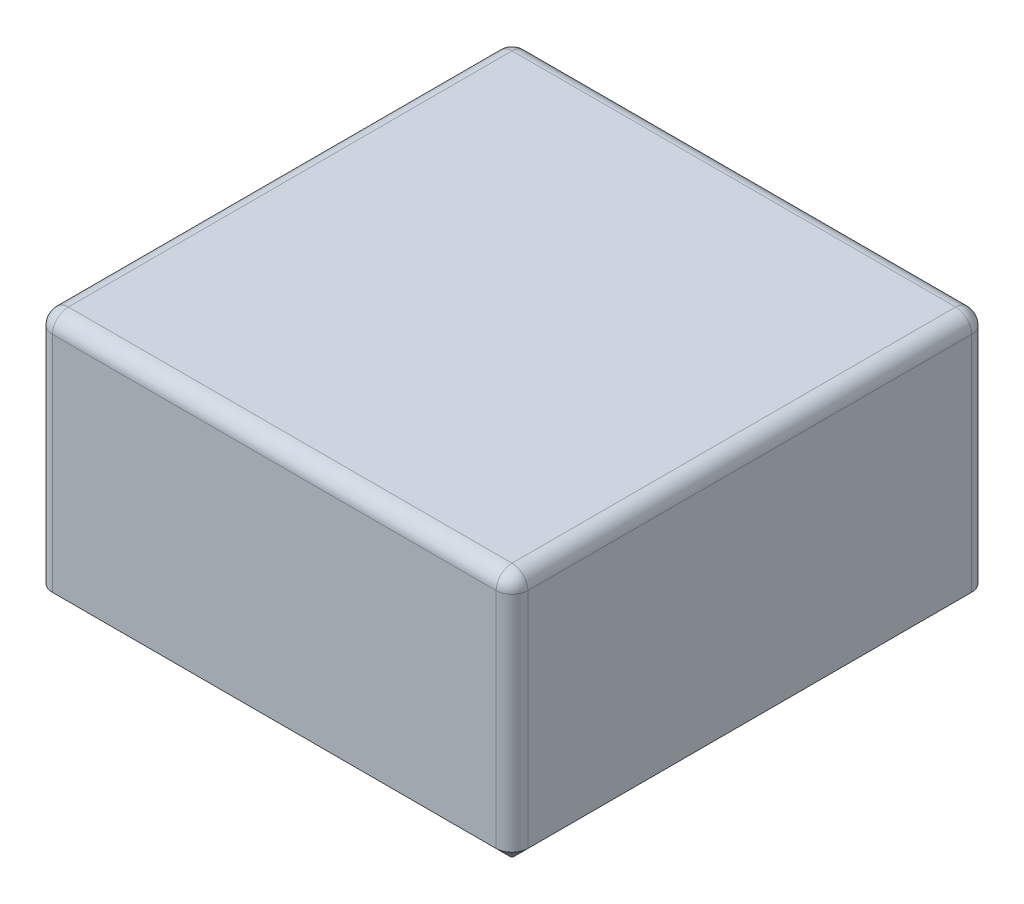
ISO-10303-21;
HEADER;
FILE_DESCRIPTION(('STEP AP214'),'2;1');
FILE_NAME('part.step','',(''),(''),'','','');
FILE_SCHEMA(('AUTOMOTIVE_DESIGN { 1 0 10303 214 1 1 1 1 }'));
ENDSEC;
DATA;
#1=APPLICATION_CONTEXT('core data for automotive mechanical design processes');
#2=APPLICATION_PROTOCOL_DEFINITION('international standard','automotive_design',2000,#1);
#3=PRODUCT_CONTEXT('',#1,'mechanical');
#4=PRODUCT('Part','Part','',(#3));
#5=PRODUCT_RELATED_PRODUCT_CATEGORY('part','',(#4));
#6=PRODUCT_DEFINITION_FORMATION('','',#4);
#7=PRODUCT_DEFINITION_CONTEXT('part definition',#1,'design');
#8=PRODUCT_DEFINITION('design','',#6,#7);
#9=PRODUCT_DEFINITION_SHAPE('','',#8);
#10=(LENGTH_UNIT() NAMED_UNIT(*) SI_UNIT(.MILLI.,.METRE.));
#11=(NAMED_UNIT(*) PLANE_ANGLE_UNIT() SI_UNIT($,.RADIAN.));
#12=(NAMED_UNIT(*) SI_UNIT($,.STERADIAN.) SOLID_ANGLE_UNIT());
#13=UNCERTAINTY_MEASURE_WITH_UNIT(LENGTH_MEASURE(1.E-05),#10,'distance_accuracy_value','');
#14=(GEOMETRIC_REPRESENTATION_CONTEXT(3) GLOBAL_UNCERTAINTY_ASSIGNED_CONTEXT((#13)) GLOBAL_UNIT_ASSIGNED_CONTEXT((#10,
#11,#12)) REPRESENTATION_CONTEXT('',''));
#15=CARTESIAN_POINT('',(0.,0.,0.));
#16=DIRECTION('',(0.,0.,1.));
#17=DIRECTION('',(1.,0.,0.));
#18=AXIS2_PLACEMENT_3D('',#15,#16,#17);
#19=CARTESIAN_POINT('',(0.,0.01,0.));
#20=DIRECTION('',(0.,1.,0.));
#21=DIRECTION('',(0.,0.,-1.));
#22=AXIS2_PLACEMENT_3D('',#19,#20,#21);
#23=PLANE('',#22);
#24=DIRECTION('',(0.,0.,-1.));
#25=VECTOR('',#24,1.);
#26=CARTESIAN_POINT('',(-0.14,0.01,0.14));
#27=LINE('',#26,#25);
#28=CARTESIAN_POINT('',(-0.14,0.01,0.14));
#29=VERTEX_POINT('',#28);
#30=CARTESIAN_POINT('',(-0.14,0.01,-0.14));
#31=VERTEX_POINT('',#30);
#32=EDGE_CURVE('E238',#29,#31,#27,.T.);
#33=ORIENTED_EDGE('',*,*,#32,.F.);
#34=DIRECTION('',(-1.,0.,0.));
#35=VECTOR('',#34,1.);
#36=CARTESIAN_POINT('',(0.14,0.01,0.14));
#37=LINE('',#36,#35);
#38=CARTESIAN_POINT('',(0.14,0.01,0.14));
#39=VERTEX_POINT('',#38);
#40=EDGE_CURVE('E401',#39,#29,#37,.T.);
#41=ORIENTED_EDGE('',*,*,#40,.F.);
#42=DIRECTION('',(0.,0.,1.));
#43=VECTOR('',#42,1.);
#44=CARTESIAN_POINT('',(0.14,0.01,-0.14));
#45=LINE('',#44,#43);
#46=CARTESIAN_POINT('',(0.14,0.01,-0.14));
#47=VERTEX_POINT('',#46);
#48=EDGE_CURVE('E11',#47,#39,#45,.T.);
#49=ORIENTED_EDGE('',*,*,#48,.F.);
#50=DIRECTION('',(1.,0.,0.));
#51=VECTOR('',#50,1.);
#52=CARTESIAN_POINT('',(-0.14,0.01,-0.14));
#53=LINE('',#52,#51);
#54=EDGE_CURVE('E404',#31,#47,#53,.T.);
#55=ORIENTED_EDGE('',*,*,#54,.F.);
#56=EDGE_LOOP('',(#33,#41,#49,#55));
#57=FACE_BOUND('',#56,.T.);
#58=ADVANCED_FACE('F17',(#57),#23,.T.);
#59=CARTESIAN_POINT('',(0.14,0.,-0.14));
#60=DIRECTION('',(0.,0.,1.));
#61=DIRECTION('',(0.,-1.,0.));
#62=AXIS2_PLACEMENT_3D('',#59,#60,#61);
#63=CYLINDRICAL_SURFACE('',#62,0.01);
#64=DIRECTION('',(0.,0.,1.));
#65=VECTOR('',#64,1.);
#66=CARTESIAN_POINT('',(0.15,0.,-0.14));
#67=LINE('',#66,#65);
#68=CARTESIAN_POINT('',(0.15,0.,-0.14));
#69=VERTEX_POINT('',#68);
#70=CARTESIAN_POINT('',(0.15,0.,0.14));
#71=VERTEX_POINT('',#70);
#72=EDGE_CURVE('E360',#69,#71,#67,.T.);
#73=ORIENTED_EDGE('',*,*,#72,.F.);
#74=CARTESIAN_POINT('',(0.14,0.,-0.14));
#75=DIRECTION('',(0.,0.,1.));
#76=DIRECTION('',(0.,-1.,0.));
#77=AXIS2_PLACEMENT_3D('',#74,#75,#76);
#78=CIRCLE('',#77,0.01);
#79=EDGE_CURVE('E25',#69,#47,#78,.T.);
#80=ORIENTED_EDGE('',*,*,#79,.T.);
#81=ORIENTED_EDGE('',*,*,#48,.T.);
#82=CARTESIAN_POINT('',(0.14,0.,0.14));
#83=DIRECTION('',(0.,0.,1.));
#84=DIRECTION('',(0.,-1.,0.));
#85=AXIS2_PLACEMENT_3D('',#82,#83,#84);
#86=CIRCLE('',#85,0.01);
#87=EDGE_CURVE('E416',#71,#39,#86,.T.);
#88=ORIENTED_EDGE('',*,*,#87,.F.);
#89=EDGE_LOOP('',(#73,#80,#81,#88));
#90=FACE_BOUND('',#89,.T.);
#91=ADVANCED_FACE('F421',(#90),#63,.T.);
#92=CARTESIAN_POINT('',(0.14,0.,-0.14));
#93=DIRECTION('',(-0.707106781186548,0.707106781186547,0.));
#94=DIRECTION('',(0.5,0.5,-0.707106781186548));
#95=AXIS2_PLACEMENT_3D('',#92,#93,#94);
#96=SPHERICAL_SURFACE('',#95,0.01);
#97=CARTESIAN_POINT('',(0.14,0.,-0.14));
#98=DIRECTION('',(0.,-1.,0.));
#99=DIRECTION('',(-1.,0.,0.));
#100=AXIS2_PLACEMENT_3D('',#97,#98,#99);
#101=CIRCLE('',#100,0.01);
#102=CARTESIAN_POINT('',(0.14,0.,-0.15));
#103=VERTEX_POINT('',#102);
#104=EDGE_CURVE('E387',#103,#69,#101,.T.);
#105=ORIENTED_EDGE('',*,*,#104,.F.);
#106=CARTESIAN_POINT('',(0.14,0.,-0.14));
#107=DIRECTION('',(1.,0.,0.));
#108=DIRECTION('',(0.,-1.,0.));
#109=AXIS2_PLACEMENT_3D('',#106,#107,#108);
#110=CIRCLE('',#109,0.01);
#111=EDGE_CURVE('E412',#103,#47,#110,.T.);
#112=ORIENTED_EDGE('',*,*,#111,.T.);
#113=ORIENTED_EDGE('',*,*,#79,.F.);
#114=EDGE_LOOP('',(#105,#112,#113));
#115=FACE_BOUND('',#114,.T.);
#116=ADVANCED_FACE('F424',(#115),#96,.T.);
#117=CARTESIAN_POINT('',(0.14,0.,0.14));
#118=DIRECTION('',(0.,0.707106781186547,-0.707106781186548));
#119=DIRECTION('',(0.707106781186548,0.5,0.5));
#120=AXIS2_PLACEMENT_3D('',#117,#118,#119);
#121=SPHERICAL_SURFACE('',#120,0.01);
#122=CARTESIAN_POINT('',(0.14,0.,0.14));
#123=DIRECTION('',(0.,-1.,0.));
#124=DIRECTION('',(0.,0.,-1.));
#125=AXIS2_PLACEMENT_3D('',#122,#123,#124);
#126=CIRCLE('',#125,0.01);
#127=CARTESIAN_POINT('',(0.14,0.,0.15));
#128=VERTEX_POINT('',#127);
#129=EDGE_CURVE('E350',#71,#128,#126,.T.);
#130=ORIENTED_EDGE('',*,*,#129,.F.);
#131=ORIENTED_EDGE('',*,*,#87,.T.);
#132=CARTESIAN_POINT('',(0.14,0.,0.14));
#133=DIRECTION('',(-1.,0.,0.));
#134=DIRECTION('',(0.,-1.,0.));
#135=AXIS2_PLACEMENT_3D('',#132,#133,#134);
#136=CIRCLE('',#135,0.01);
#137=EDGE_CURVE('E405',#128,#39,#136,.T.);
#138=ORIENTED_EDGE('',*,*,#137,.F.);
#139=EDGE_LOOP('',(#130,#131,#138));
#140=FACE_BOUND('',#139,.T.);
#141=ADVANCED_FACE('F507',(#140),#121,.T.);
#142=CARTESIAN_POINT('',(-0.14,0.,-0.14));
#143=DIRECTION('',(1.,0.,0.));
#144=DIRECTION('',(0.,-1.,0.));
#145=AXIS2_PLACEMENT_3D('',#142,#143,#144);
#146=CYLINDRICAL_SURFACE('',#145,0.01);
#147=DIRECTION('',(1.,0.,0.));
#148=VECTOR('',#147,1.);
#149=CARTESIAN_POINT('',(-0.14,0.,-0.15));
#150=LINE('',#149,#148);
#151=CARTESIAN_POINT('',(-0.14,0.,-0.15));
#152=VERTEX_POINT('',#151);
#153=EDGE_CURVE('E351',#152,#103,#150,.T.);
#154=ORIENTED_EDGE('',*,*,#153,.F.);
#155=CARTESIAN_POINT('',(-0.14,0.,-0.14));
#156=DIRECTION('',(1.,0.,0.));
#157=DIRECTION('',(0.,-1.,0.));
#158=AXIS2_PLACEMENT_3D('',#155,#156,#157);
#159=CIRCLE('',#158,0.01);
#160=EDGE_CURVE('E400',#152,#31,#159,.T.);
#161=ORIENTED_EDGE('',*,*,#160,.T.);
#162=ORIENTED_EDGE('',*,*,#54,.T.);
#163=ORIENTED_EDGE('',*,*,#111,.F.);
#164=EDGE_LOOP('',(#154,#161,#162,#163));
#165=FACE_BOUND('',#164,.T.);
#166=ADVANCED_FACE('F427',(#165),#146,.T.);
#167=CARTESIAN_POINT('',(0.14,0.,0.14));
#168=DIRECTION('',(-1.,0.,0.));
#169=DIRECTION('',(0.,-1.,0.));
#170=AXIS2_PLACEMENT_3D('',#167,#168,#169);
#171=CYLINDRICAL_SURFACE('',#170,0.01);
#172=DIRECTION('',(-1.,0.,0.));
#173=VECTOR('',#172,1.);
#174=CARTESIAN_POINT('',(0.14,0.,0.15));
#175=LINE('',#174,#173);
#176=CARTESIAN_POINT('',(-0.14,0.,0.15));
#177=VERTEX_POINT('',#176);
#178=EDGE_CURVE('E371',#128,#177,#175,.T.);
#179=ORIENTED_EDGE('',*,*,#178,.F.);
#180=ORIENTED_EDGE('',*,*,#137,.T.);
#181=ORIENTED_EDGE('',*,*,#40,.T.);
#182=CARTESIAN_POINT('',(-0.14,0.,0.14));
#183=DIRECTION('',(-1.,0.,0.));
#184=DIRECTION('',(0.,-1.,0.));
#185=AXIS2_PLACEMENT_3D('',#182,#183,#184);
#186=CIRCLE('',#185,0.01);
#187=EDGE_CURVE('E237',#177,#29,#186,.T.);
#188=ORIENTED_EDGE('',*,*,#187,.F.);
#189=EDGE_LOOP('',(#179,#180,#181,#188));
#190=FACE_BOUND('',#189,.T.);
#191=ADVANCED_FACE('F457',(#190),#171,.T.);
#192=CARTESIAN_POINT('',(-0.14,0.,-0.14));
#193=DIRECTION('',(0.,0.707106781186547,0.707106781186548));
#194=DIRECTION('',(-0.707106781186548,0.5,-0.5));
#195=AXIS2_PLACEMENT_3D('',#192,#193,#194);
#196=SPHERICAL_SURFACE('',#195,0.01);
#197=CARTESIAN_POINT('',(-0.14,0.,-0.14));
#198=DIRECTION('',(0.,-1.,0.));
#199=DIRECTION('',(0.,0.,1.));
#200=AXIS2_PLACEMENT_3D('',#197,#198,#199);
#201=CIRCLE('',#200,0.01);
#202=CARTESIAN_POINT('',(-0.15,0.,-0.14));
#203=VERTEX_POINT('',#202);
#204=EDGE_CURVE('E253',#203,#152,#201,.T.);
#205=ORIENTED_EDGE('',*,*,#204,.F.);
#206=CARTESIAN_POINT('',(-0.14,0.,-0.14));
#207=DIRECTION('',(0.,0.,-1.));
#208=DIRECTION('',(0.,-1.,0.));
#209=AXIS2_PLACEMENT_3D('',#206,#207,#208);
#210=CIRCLE('',#209,0.01);
#211=EDGE_CURVE('E233',#203,#31,#210,.T.);
#212=ORIENTED_EDGE('',*,*,#211,.T.);
#213=ORIENTED_EDGE('',*,*,#160,.F.);
#214=EDGE_LOOP('',(#205,#212,#213));
#215=FACE_BOUND('',#214,.T.);
#216=ADVANCED_FACE('F488',(#215),#196,.T.);
#217=CARTESIAN_POINT('',(-0.14,0.,0.14));
#218=DIRECTION('',(0.,-0.707106781186547,0.707106781186548));
#219=DIRECTION('',(-0.707106781186547,0.5,0.5));
#220=AXIS2_PLACEMENT_3D('',#217,#218,#219);
#221=SPHERICAL_SURFACE('',#220,0.01);
#222=CARTESIAN_POINT('',(-0.14,0.,0.14));
#223=DIRECTION('',(0.,1.,0.));
#224=DIRECTION('',(0.,0.,-1.));
#225=AXIS2_PLACEMENT_3D('',#222,#223,#224);
#226=CIRCLE('',#225,0.01);
#227=CARTESIAN_POINT('',(-0.15,0.,0.14));
#228=VERTEX_POINT('',#227);
#229=EDGE_CURVE('E270',#228,#177,#226,.T.);
#230=ORIENTED_EDGE('',*,*,#229,.T.);
#231=ORIENTED_EDGE('',*,*,#187,.T.);
#232=CARTESIAN_POINT('',(-0.14,0.,0.14));
#233=DIRECTION('',(0.,0.,-1.));
#234=DIRECTION('',(0.,-1.,0.));
#235=AXIS2_PLACEMENT_3D('',#232,#233,#234);
#236=CIRCLE('',#235,0.01);
#237=EDGE_CURVE('E356',#228,#29,#236,.T.);
#238=ORIENTED_EDGE('',*,*,#237,.F.);
#239=EDGE_LOOP('',(#230,#231,#238));
#240=FACE_BOUND('',#239,.T.);
#241=ADVANCED_FACE('F436',(#240),#221,.T.);
#242=CARTESIAN_POINT('',(-0.14,0.,0.14));
#243=DIRECTION('',(0.,0.,-1.));
#244=DIRECTION('',(0.,-1.,0.));
#245=AXIS2_PLACEMENT_3D('',#242,#243,#244);
#246=CYLINDRICAL_SURFACE('',#245,0.01);
#247=DIRECTION('',(0.,0.,-1.));
#248=VECTOR('',#247,1.);
#249=CARTESIAN_POINT('',(-0.15,0.,0.14));
#250=LINE('',#249,#248);
#251=EDGE_CURVE('E227',#228,#203,#250,.T.);
#252=ORIENTED_EDGE('',*,*,#251,.F.);
#253=ORIENTED_EDGE('',*,*,#237,.T.);
#254=ORIENTED_EDGE('',*,*,#32,.T.);
#255=ORIENTED_EDGE('',*,*,#211,.F.);
#256=EDGE_LOOP('',(#252,#253,#254,#255));
#257=FACE_BOUND('',#256,.T.);
#258=ADVANCED_FACE('F432',(#257),#246,.T.);
#259=CARTESIAN_POINT('',(0.,0.,0.));
#260=DIRECTION('',(0.,1.,0.));
#261=DIRECTION('',(0.,0.,-1.));
#262=AXIS2_PLACEMENT_3D('',#259,#260,#261);
#263=PLANE('',#262);
#264=DIRECTION('',(0.,0.,-1.));
#265=VECTOR('',#264,1.);
#266=CARTESIAN_POINT('',(-0.14,0.,0.14));
#267=LINE('',#266,#265);
#268=CARTESIAN_POINT('',(-0.14,0.,0.14));
#269=VERTEX_POINT('',#268);
#270=CARTESIAN_POINT('',(-0.14,0.,-0.14));
#271=VERTEX_POINT('',#270);
#272=EDGE_CURVE('E271',#269,#271,#267,.T.);
#273=ORIENTED_EDGE('',*,*,#272,.T.);
#274=DIRECTION('',(1.,0.,0.));
#275=VECTOR('',#274,1.);
#276=CARTESIAN_POINT('',(-0.14,0.,-0.14));
#277=LINE('',#276,#275);
#278=CARTESIAN_POINT('',(0.14,0.,-0.14));
#279=VERTEX_POINT('',#278);
#280=EDGE_CURVE('E287',#271,#279,#277,.T.);
#281=ORIENTED_EDGE('',*,*,#280,.T.);
#282=DIRECTION('',(0.,0.,1.));
#283=VECTOR('',#282,1.);
#284=CARTESIAN_POINT('',(0.14,0.,-0.14));
#285=LINE('',#284,#283);
#286=CARTESIAN_POINT('',(0.14,0.,0.14));
#287=VERTEX_POINT('',#286);
#288=EDGE_CURVE('E286',#279,#287,#285,.T.);
#289=ORIENTED_EDGE('',*,*,#288,.T.);
#290=DIRECTION('',(-1.,0.,0.));
#291=VECTOR('',#290,1.);
#292=CARTESIAN_POINT('',(0.14,0.,0.14));
#293=LINE('',#292,#291);
#294=EDGE_CURVE('E228',#287,#269,#293,.T.);
#295=ORIENTED_EDGE('',*,*,#294,.T.);
#296=EDGE_LOOP('',(#273,#281,#289,#295));
#297=FACE_BOUND('',#296,.T.);
#298=ADVANCED_FACE('F516',(#297),#263,.F.);
#299=CARTESIAN_POINT('',(0.15,0.,-0.14));
#300=DIRECTION('',(-1.,0.,0.));
#301=DIRECTION('',(0.,0.,1.));
#302=AXIS2_PLACEMENT_3D('',#299,#300,#301);
#303=PLANE('',#302);
#304=DIRECTION('',(0.,-1.,0.));
#305=VECTOR('',#304,1.);
#306=CARTESIAN_POINT('',(0.15,0.,0.14));
#307=LINE('',#306,#305);
#308=CARTESIAN_POINT('',(0.15,-0.141,0.14));
#309=VERTEX_POINT('',#308);
#310=EDGE_CURVE('E347',#71,#309,#307,.T.);
#311=ORIENTED_EDGE('',*,*,#310,.T.);
#312=DIRECTION('',(0.,0.,1.));
#313=VECTOR('',#312,1.);
#314=CARTESIAN_POINT('',(0.15,-0.141,-0.14));
#315=LINE('',#314,#313);
#316=CARTESIAN_POINT('',(0.15,-0.141,-0.14));
#317=VERTEX_POINT('',#316);
#318=EDGE_CURVE('E221',#317,#309,#315,.T.);
#319=ORIENTED_EDGE('',*,*,#318,.F.);
#320=DIRECTION('',(0.,-1.,0.));
#321=VECTOR('',#320,1.);
#322=CARTESIAN_POINT('',(0.15,0.,-0.14));
#323=LINE('',#322,#321);
#324=EDGE_CURVE('E384',#69,#317,#323,.T.);
#325=ORIENTED_EDGE('',*,*,#324,.F.);
#326=ORIENTED_EDGE('',*,*,#72,.T.);
#327=EDGE_LOOP('',(#311,#319,#325,#326));
#328=FACE_BOUND('',#327,.T.);
#329=ADVANCED_FACE('F473',(#328),#303,.F.);
#330=CARTESIAN_POINT('',(0.14,0.,-0.14));
#331=DIRECTION('',(0.,-1.,0.));
#332=DIRECTION('',(-1.,0.,0.));
#333=AXIS2_PLACEMENT_3D('',#330,#331,#332);
#334=CYLINDRICAL_SURFACE('',#333,0.01);
#335=ORIENTED_EDGE('',*,*,#324,.T.);
#336=CARTESIAN_POINT('',(0.14,-0.141,-0.14));
#337=DIRECTION('',(0.,-1.,0.));
#338=DIRECTION('',(0.,0.,-1.));
#339=AXIS2_PLACEMENT_3D('',#336,#337,#338);
#340=CIRCLE('',#339,0.01);
#341=CARTESIAN_POINT('',(0.14,-0.141,-0.15));
#342=VERTEX_POINT('',#341);
#343=EDGE_CURVE('E324',#342,#317,#340,.T.);
#344=ORIENTED_EDGE('',*,*,#343,.F.);
#345=DIRECTION('',(0.,-1.,0.));
#346=VECTOR('',#345,1.);
#347=CARTESIAN_POINT('',(0.14,0.,-0.15));
#348=LINE('',#347,#346);
#349=EDGE_CURVE('E375',#103,#342,#348,.T.);
#350=ORIENTED_EDGE('',*,*,#349,.F.);
#351=ORIENTED_EDGE('',*,*,#104,.T.);
#352=EDGE_LOOP('',(#335,#344,#350,#351));
#353=FACE_BOUND('',#352,.T.);
#354=ADVANCED_FACE('F476',(#353),#334,.T.);
#355=CARTESIAN_POINT('',(0.14,0.,0.14));
#356=DIRECTION('',(0.,-1.,0.));
#357=DIRECTION('',(0.,0.,-1.));
#358=AXIS2_PLACEMENT_3D('',#355,#356,#357);
#359=CYLINDRICAL_SURFACE('',#358,0.01);
#360=DIRECTION('',(0.,-1.,0.));
#361=VECTOR('',#360,1.);
#362=CARTESIAN_POINT('',(0.14,0.,0.15));
#363=LINE('',#362,#361);
#364=CARTESIAN_POINT('',(0.14,-0.141,0.15));
#365=VERTEX_POINT('',#364);
#366=EDGE_CURVE('E257',#128,#365,#363,.T.);
#367=ORIENTED_EDGE('',*,*,#366,.T.);
#368=CARTESIAN_POINT('',(0.14,-0.141,0.14));
#369=DIRECTION('',(0.,-1.,0.));
#370=DIRECTION('',(1.,0.,0.));
#371=AXIS2_PLACEMENT_3D('',#368,#369,#370);
#372=CIRCLE('',#371,0.01);
#373=EDGE_CURVE('E320',#309,#365,#372,.T.);
#374=ORIENTED_EDGE('',*,*,#373,.F.);
#375=ORIENTED_EDGE('',*,*,#310,.F.);
#376=ORIENTED_EDGE('',*,*,#129,.T.);
#377=EDGE_LOOP('',(#367,#374,#375,#376));
#378=FACE_BOUND('',#377,.T.);
#379=ADVANCED_FACE('F453',(#378),#359,.T.);
#380=CARTESIAN_POINT('',(-0.14,0.,-0.15));
#381=DIRECTION('',(0.,0.,1.));
#382=DIRECTION('',(1.,0.,0.));
#383=AXIS2_PLACEMENT_3D('',#380,#381,#382);
#384=PLANE('',#383);
#385=ORIENTED_EDGE('',*,*,#349,.T.);
#386=DIRECTION('',(1.,0.,0.));
#387=VECTOR('',#386,1.);
#388=CARTESIAN_POINT('',(-0.14,-0.141,-0.15));
#389=LINE('',#388,#387);
#390=CARTESIAN_POINT('',(-0.14,-0.141,-0.15));
#391=VERTEX_POINT('',#390);
#392=EDGE_CURVE('E308',#391,#342,#389,.T.);
#393=ORIENTED_EDGE('',*,*,#392,.F.);
#394=DIRECTION('',(0.,-1.,0.));
#395=VECTOR('',#394,1.);
#396=CARTESIAN_POINT('',(-0.14,0.,-0.15));
#397=LINE('',#396,#395);
#398=EDGE_CURVE('E258',#152,#391,#397,.T.);
#399=ORIENTED_EDGE('',*,*,#398,.F.);
#400=ORIENTED_EDGE('',*,*,#153,.T.);
#401=EDGE_LOOP('',(#385,#393,#399,#400));
#402=FACE_BOUND('',#401,.T.);
#403=ADVANCED_FACE('F480',(#402),#384,.F.);
#404=CARTESIAN_POINT('',(0.14,0.,0.15));
#405=DIRECTION('',(0.,0.,-1.));
#406=DIRECTION('',(0.,-1.,0.));
#407=AXIS2_PLACEMENT_3D('',#404,#405,#406);
#408=PLANE('',#407);
#409=ORIENTED_EDGE('',*,*,#366,.F.);
#410=ORIENTED_EDGE('',*,*,#178,.T.);
#411=DIRECTION('',(0.,-1.,0.));
#412=VECTOR('',#411,1.);
#413=CARTESIAN_POINT('',(-0.14,0.,0.15));
#414=LINE('',#413,#412);
#415=CARTESIAN_POINT('',(-0.14,-0.141,0.15));
#416=VERTEX_POINT('',#415);
#417=EDGE_CURVE('E363',#177,#416,#414,.T.);
#418=ORIENTED_EDGE('',*,*,#417,.T.);
#419=DIRECTION('',(-1.,0.,0.));
#420=VECTOR('',#419,1.);
#421=CARTESIAN_POINT('',(0.14,-0.141,0.15));
#422=LINE('',#421,#420);
#423=EDGE_CURVE('E304',#365,#416,#422,.T.);
#424=ORIENTED_EDGE('',*,*,#423,.F.);
#425=EDGE_LOOP('',(#409,#410,#418,#424));
#426=FACE_BOUND('',#425,.T.);
#427=ADVANCED_FACE('F443',(#426),#408,.F.);
#428=CARTESIAN_POINT('',(-0.14,0.,-0.14));
#429=DIRECTION('',(0.,-1.,0.));
#430=DIRECTION('',(0.,0.,1.));
#431=AXIS2_PLACEMENT_3D('',#428,#429,#430);
#432=CYLINDRICAL_SURFACE('',#431,0.01);
#433=ORIENTED_EDGE('',*,*,#398,.T.);
#434=CARTESIAN_POINT('',(-0.14,-0.141,-0.14));
#435=DIRECTION('',(0.,-1.,0.));
#436=DIRECTION('',(-1.,0.,0.));
#437=AXIS2_PLACEMENT_3D('',#434,#435,#436);
#438=CIRCLE('',#437,0.01);
#439=CARTESIAN_POINT('',(-0.15,-0.141,-0.14));
#440=VERTEX_POINT('',#439);
#441=EDGE_CURVE('E292',#440,#391,#438,.T.);
#442=ORIENTED_EDGE('',*,*,#441,.F.);
#443=DIRECTION('',(0.,-1.,0.));
#444=VECTOR('',#443,1.);
#445=CARTESIAN_POINT('',(-0.15,0.,-0.14));
#446=LINE('',#445,#444);
#447=EDGE_CURVE('E355',#203,#440,#446,.T.);
#448=ORIENTED_EDGE('',*,*,#447,.F.);
#449=ORIENTED_EDGE('',*,*,#204,.T.);
#450=EDGE_LOOP('',(#433,#442,#448,#449));
#451=FACE_BOUND('',#450,.T.);
#452=ADVANCED_FACE('F485',(#451),#432,.T.);
#453=CARTESIAN_POINT('',(-0.14,0.,0.14));
#454=DIRECTION('',(0.,-1.,0.));
#455=DIRECTION('',(0.,0.,-1.));
#456=AXIS2_PLACEMENT_3D('',#453,#454,#455);
#457=CYLINDRICAL_SURFACE('',#456,0.01);
#458=ORIENTED_EDGE('',*,*,#417,.F.);
#459=ORIENTED_EDGE('',*,*,#229,.F.);
#460=DIRECTION('',(0.,-1.,0.));
#461=VECTOR('',#460,1.);
#462=CARTESIAN_POINT('',(-0.15,0.,0.14));
#463=LINE('',#462,#461);
#464=CARTESIAN_POINT('',(-0.15,-0.141,0.14));
#465=VERTEX_POINT('',#464);
#466=EDGE_CURVE('E224',#228,#465,#463,.T.);
#467=ORIENTED_EDGE('',*,*,#466,.T.);
#468=CARTESIAN_POINT('',(-0.14,-0.141,0.14));
#469=DIRECTION('',(0.,-1.,0.));
#470=DIRECTION('',(0.,0.,1.));
#471=AXIS2_PLACEMENT_3D('',#468,#469,#470);
#472=CIRCLE('',#471,0.01);
#473=EDGE_CURVE('E188',#416,#465,#472,.T.);
#474=ORIENTED_EDGE('',*,*,#473,.F.);
#475=EDGE_LOOP('',(#458,#459,#467,#474));
#476=FACE_BOUND('',#475,.T.);
#477=ADVANCED_FACE('F439',(#476),#457,.T.);
#478=CARTESIAN_POINT('',(-0.15,0.,0.14));
#479=DIRECTION('',(1.,0.,0.));
#480=DIRECTION('',(0.,1.,0.));
#481=AXIS2_PLACEMENT_3D('',#478,#479,#480);
#482=PLANE('',#481);
#483=ORIENTED_EDGE('',*,*,#466,.F.);
#484=ORIENTED_EDGE('',*,*,#251,.T.);
#485=ORIENTED_EDGE('',*,*,#447,.T.);
#486=DIRECTION('',(0.,0.,-1.));
#487=VECTOR('',#486,1.);
#488=CARTESIAN_POINT('',(-0.15,-0.141,0.14));
#489=LINE('',#488,#487);
#490=EDGE_CURVE('E194',#465,#440,#489,.T.);
#491=ORIENTED_EDGE('',*,*,#490,.F.);
#492=EDGE_LOOP('',(#483,#484,#485,#491));
#493=FACE_BOUND('',#492,.T.);
#494=ADVANCED_FACE('F530',(#493),#482,.F.);
#495=CARTESIAN_POINT('',(0.14,0.,0.14));
#496=DIRECTION('',(0.,0.,-1.));
#497=DIRECTION('',(0.,-1.,0.));
#498=AXIS2_PLACEMENT_3D('',#495,#496,#497);
#499=PLANE('',#498);
#500=DIRECTION('',(0.,-1.,0.));
#501=VECTOR('',#500,1.);
#502=CARTESIAN_POINT('',(0.14,0.,0.14));
#503=LINE('',#502,#501);
#504=CARTESIAN_POINT('',(0.14,-0.15,0.14));
#505=VERTEX_POINT('',#504);
#506=EDGE_CURVE('E283',#287,#505,#503,.T.);
#507=ORIENTED_EDGE('',*,*,#506,.T.);
#508=DIRECTION('',(-1.,0.,0.));
#509=VECTOR('',#508,1.);
#510=CARTESIAN_POINT('',(0.14,-0.15,0.14));
#511=LINE('',#510,#509);
#512=CARTESIAN_POINT('',(-0.14,-0.15,0.14));
#513=VERTEX_POINT('',#512);
#514=EDGE_CURVE('E267',#505,#513,#511,.T.);
#515=ORIENTED_EDGE('',*,*,#514,.T.);
#516=DIRECTION('',(0.,-1.,0.));
#517=VECTOR('',#516,1.);
#518=CARTESIAN_POINT('',(-0.14,0.,0.14));
#519=LINE('',#518,#517);
#520=EDGE_CURVE('E332',#269,#513,#519,.T.);
#521=ORIENTED_EDGE('',*,*,#520,.F.);
#522=ORIENTED_EDGE('',*,*,#294,.F.);
#523=EDGE_LOOP('',(#507,#515,#521,#522));
#524=FACE_BOUND('',#523,.T.);
#525=ADVANCED_FACE('F533',(#524),#499,.T.);
#526=CARTESIAN_POINT('',(0.14,0.,-0.14));
#527=DIRECTION('',(-1.,0.,0.));
#528=DIRECTION('',(0.,0.,1.));
#529=AXIS2_PLACEMENT_3D('',#526,#527,#528);
#530=PLANE('',#529);
#531=DIRECTION('',(0.,-1.,0.));
#532=VECTOR('',#531,1.);
#533=CARTESIAN_POINT('',(0.14,0.,-0.14));
#534=LINE('',#533,#532);
#535=CARTESIAN_POINT('',(0.14,-0.15,-0.14));
#536=VERTEX_POINT('',#535);
#537=EDGE_CURVE('E275',#279,#536,#534,.T.);
#538=ORIENTED_EDGE('',*,*,#537,.T.);
#539=DIRECTION('',(0.,0.,1.));
#540=VECTOR('',#539,1.);
#541=CARTESIAN_POINT('',(0.14,-0.15,-0.14));
#542=LINE('',#541,#540);
#543=EDGE_CURVE('E252',#536,#505,#542,.T.);
#544=ORIENTED_EDGE('',*,*,#543,.T.);
#545=ORIENTED_EDGE('',*,*,#506,.F.);
#546=ORIENTED_EDGE('',*,*,#288,.F.);
#547=EDGE_LOOP('',(#538,#544,#545,#546));
#548=FACE_BOUND('',#547,.T.);
#549=ADVANCED_FACE('F537',(#548),#530,.T.);
#550=CARTESIAN_POINT('',(-0.14,0.,-0.14));
#551=DIRECTION('',(0.,0.,1.));
#552=DIRECTION('',(1.,0.,0.));
#553=AXIS2_PLACEMENT_3D('',#550,#551,#552);
#554=PLANE('',#553);
#555=DIRECTION('',(0.,-1.,0.));
#556=VECTOR('',#555,1.);
#557=CARTESIAN_POINT('',(-0.14,0.,-0.14));
#558=LINE('',#557,#556);
#559=CARTESIAN_POINT('',(-0.14,-0.15,-0.14));
#560=VERTEX_POINT('',#559);
#561=EDGE_CURVE('E276',#271,#560,#558,.T.);
#562=ORIENTED_EDGE('',*,*,#561,.T.);
#563=DIRECTION('',(1.,0.,0.));
#564=VECTOR('',#563,1.);
#565=CARTESIAN_POINT('',(-0.14,-0.15,-0.14));
#566=LINE('',#565,#564);
#567=EDGE_CURVE('E195',#560,#536,#566,.T.);
#568=ORIENTED_EDGE('',*,*,#567,.T.);
#569=ORIENTED_EDGE('',*,*,#537,.F.);
#570=ORIENTED_EDGE('',*,*,#280,.F.);
#571=EDGE_LOOP('',(#562,#568,#569,#570));
#572=FACE_BOUND('',#571,.T.);
#573=ADVANCED_FACE('F540',(#572),#554,.T.);
#574=CARTESIAN_POINT('',(-0.14,0.,0.14));
#575=DIRECTION('',(1.,0.,0.));
#576=DIRECTION('',(0.,1.,0.));
#577=AXIS2_PLACEMENT_3D('',#574,#575,#576);
#578=PLANE('',#577);
#579=ORIENTED_EDGE('',*,*,#520,.T.);
#580=DIRECTION('',(0.,0.,-1.));
#581=VECTOR('',#580,1.);
#582=CARTESIAN_POINT('',(-0.14,-0.15,0.14));
#583=LINE('',#582,#581);
#584=EDGE_CURVE('E206',#513,#560,#583,.T.);
#585=ORIENTED_EDGE('',*,*,#584,.T.);
#586=ORIENTED_EDGE('',*,*,#561,.F.);
#587=ORIENTED_EDGE('',*,*,#272,.F.);
#588=EDGE_LOOP('',(#579,#585,#586,#587));
#589=FACE_BOUND('',#588,.T.);
#590=ADVANCED_FACE('F542',(#589),#578,.T.);
#591=CARTESIAN_POINT('',(0.1455,-0.1455,-0.14));
#592=DIRECTION('',(0.707106781186548,-0.707106781186548,0.));
#593=DIRECTION('',(0.,0.,-1.));
#594=AXIS2_PLACEMENT_3D('',#591,#592,#593);
#595=PLANE('',#594);
#596=DIRECTION('',(0.707106781186548,0.707106781186548,0.));
#597=VECTOR('',#596,1.);
#598=CARTESIAN_POINT('',(0.15,-0.141,-0.14));
#599=LINE('',#598,#597);
#600=CARTESIAN_POINT('',(0.141,-0.15,-0.14));
#601=VERTEX_POINT('',#600);
#602=EDGE_CURVE('E328',#601,#317,#599,.T.);
#603=ORIENTED_EDGE('',*,*,#602,.T.);
#604=ORIENTED_EDGE('',*,*,#318,.T.);
#605=DIRECTION('',(0.707106781186548,0.707106781186548,0.));
#606=VECTOR('',#605,1.);
#607=CARTESIAN_POINT('',(0.1455,-0.1455,0.14));
#608=LINE('',#607,#606);
#609=CARTESIAN_POINT('',(0.141,-0.15,0.14));
#610=VERTEX_POINT('',#609);
#611=EDGE_CURVE('E316',#610,#309,#608,.T.);
#612=ORIENTED_EDGE('',*,*,#611,.F.);
#613=DIRECTION('',(0.,0.,1.));
#614=VECTOR('',#613,1.);
#615=CARTESIAN_POINT('',(0.141,-0.15,-0.14));
#616=LINE('',#615,#614);
#617=EDGE_CURVE('E242',#601,#610,#616,.T.);
#618=ORIENTED_EDGE('',*,*,#617,.F.);
#619=EDGE_LOOP('',(#603,#604,#612,#618));
#620=FACE_BOUND('',#619,.T.);
#621=ADVANCED_FACE('F469',(#620),#595,.T.);
#622=CARTESIAN_POINT('',(0.14,-0.141,-0.14));
#623=DIRECTION('',(0.,1.,0.));
#624=DIRECTION('',(0.,0.,-1.));
#625=AXIS2_PLACEMENT_3D('',#622,#623,#624);
#626=CONICAL_SURFACE('',#625,0.01,0.785398163397);
#627=DIRECTION('',(0.,0.707106781186548,-0.707106781186548));
#628=VECTOR('',#627,1.);
#629=CARTESIAN_POINT('',(0.14,-0.1455,-0.1455));
#630=LINE('',#629,#628);
#631=CARTESIAN_POINT('',(0.14,-0.15,-0.141));
#632=VERTEX_POINT('',#631);
#633=EDGE_CURVE('E312',#632,#342,#630,.T.);
#634=ORIENTED_EDGE('',*,*,#633,.T.);
#635=ORIENTED_EDGE('',*,*,#343,.T.);
#636=ORIENTED_EDGE('',*,*,#602,.F.);
#637=CARTESIAN_POINT('',(0.14,-0.15,-0.14));
#638=DIRECTION('',(0.,-1.,0.));
#639=DIRECTION('',(0.,0.,-1.));
#640=AXIS2_PLACEMENT_3D('',#637,#638,#639);
#641=CIRCLE('',#640,0.001);
#642=EDGE_CURVE('E232',#632,#601,#641,.T.);
#643=ORIENTED_EDGE('',*,*,#642,.F.);
#644=EDGE_LOOP('',(#634,#635,#636,#643));
#645=FACE_BOUND('',#644,.T.);
#646=ADVANCED_FACE('F548',(#645),#626,.T.);
#647=CARTESIAN_POINT('',(0.14,-0.141,0.14));
#648=DIRECTION('',(0.,1.,0.));
#649=DIRECTION('',(1.,0.,0.));
#650=AXIS2_PLACEMENT_3D('',#647,#648,#649);
#651=CONICAL_SURFACE('',#650,0.01,0.785398163397);
#652=ORIENTED_EDGE('',*,*,#611,.T.);
#653=ORIENTED_EDGE('',*,*,#373,.T.);
#654=DIRECTION('',(0.,0.707106781186548,0.707106781186548));
#655=VECTOR('',#654,1.);
#656=CARTESIAN_POINT('',(0.14,-0.141,0.15));
#657=LINE('',#656,#655);
#658=CARTESIAN_POINT('',(0.14,-0.15,0.141));
#659=VERTEX_POINT('',#658);
#660=EDGE_CURVE('E300',#659,#365,#657,.T.);
#661=ORIENTED_EDGE('',*,*,#660,.F.);
#662=CARTESIAN_POINT('',(0.14,-0.15,0.14));
#663=DIRECTION('',(0.,-1.,0.));
#664=DIRECTION('',(1.,0.,0.));
#665=AXIS2_PLACEMENT_3D('',#662,#663,#664);
#666=CIRCLE('',#665,0.001);
#667=EDGE_CURVE('E245',#610,#659,#666,.T.);
#668=ORIENTED_EDGE('',*,*,#667,.F.);
#669=EDGE_LOOP('',(#652,#653,#661,#668));
#670=FACE_BOUND('',#669,.T.);
#671=ADVANCED_FACE('F449',(#670),#651,.T.);
#672=CARTESIAN_POINT('',(-0.14,-0.1455,-0.1455));
#673=DIRECTION('',(0.,-0.707106781186548,-0.707106781186548));
#674=DIRECTION('',(0.,-0.707106781186548,0.707106781186548));
#675=AXIS2_PLACEMENT_3D('',#672,#673,#674);
#676=PLANE('',#675);
#677=DIRECTION('',(0.,0.707106781186548,-0.707106781186548));
#678=VECTOR('',#677,1.);
#679=CARTESIAN_POINT('',(-0.14,-0.141,-0.15));
#680=LINE('',#679,#678);
#681=CARTESIAN_POINT('',(-0.14,-0.15,-0.141));
#682=VERTEX_POINT('',#681);
#683=EDGE_CURVE('E296',#682,#391,#680,.T.);
#684=ORIENTED_EDGE('',*,*,#683,.T.);
#685=ORIENTED_EDGE('',*,*,#392,.T.);
#686=ORIENTED_EDGE('',*,*,#633,.F.);
#687=DIRECTION('',(1.,0.,0.));
#688=VECTOR('',#687,1.);
#689=CARTESIAN_POINT('',(-0.14,-0.15,-0.141));
#690=LINE('',#689,#688);
#691=EDGE_CURVE('E218',#682,#632,#690,.T.);
#692=ORIENTED_EDGE('',*,*,#691,.F.);
#693=EDGE_LOOP('',(#684,#685,#686,#692));
#694=FACE_BOUND('',#693,.T.);
#695=ADVANCED_FACE('F557',(#694),#676,.T.);
#696=CARTESIAN_POINT('',(0.14,-0.1455,0.1455));
#697=DIRECTION('',(0.,-0.707106781186548,0.707106781186548));
#698=DIRECTION('',(-1.,0.,0.));
#699=AXIS2_PLACEMENT_3D('',#696,#697,#698);
#700=PLANE('',#699);
#701=ORIENTED_EDGE('',*,*,#660,.T.);
#702=ORIENTED_EDGE('',*,*,#423,.T.);
#703=DIRECTION('',(0.,0.707106781186548,0.707106781186548));
#704=VECTOR('',#703,1.);
#705=CARTESIAN_POINT('',(-0.14,-0.1455,0.1455));
#706=LINE('',#705,#704);
#707=CARTESIAN_POINT('',(-0.14,-0.15,0.141));
#708=VERTEX_POINT('',#707);
#709=EDGE_CURVE('E263',#708,#416,#706,.T.);
#710=ORIENTED_EDGE('',*,*,#709,.F.);
#711=DIRECTION('',(-1.,0.,0.));
#712=VECTOR('',#711,1.);
#713=CARTESIAN_POINT('',(0.14,-0.15,0.141));
#714=LINE('',#713,#712);
#715=EDGE_CURVE('E204',#659,#708,#714,.T.);
#716=ORIENTED_EDGE('',*,*,#715,.F.);
#717=EDGE_LOOP('',(#701,#702,#710,#716));
#718=FACE_BOUND('',#717,.T.);
#719=ADVANCED_FACE('F446',(#718),#700,.T.);
#720=CARTESIAN_POINT('',(-0.14,-0.141,-0.14));
#721=DIRECTION('',(0.,1.,0.));
#722=DIRECTION('',(-1.,0.,0.));
#723=AXIS2_PLACEMENT_3D('',#720,#721,#722);
#724=CONICAL_SURFACE('',#723,0.01,0.785398163397);
#725=DIRECTION('',(-0.707106781186548,0.707106781186548,0.));
#726=VECTOR('',#725,1.);
#727=CARTESIAN_POINT('',(-0.1455,-0.1455,-0.14));
#728=LINE('',#727,#726);
#729=CARTESIAN_POINT('',(-0.141,-0.15,-0.14));
#730=VERTEX_POINT('',#729);
#731=EDGE_CURVE('E210',#730,#440,#728,.T.);
#732=ORIENTED_EDGE('',*,*,#731,.T.);
#733=ORIENTED_EDGE('',*,*,#441,.T.);
#734=ORIENTED_EDGE('',*,*,#683,.F.);
#735=CARTESIAN_POINT('',(-0.14,-0.15,-0.14));
#736=DIRECTION('',(0.,-1.,0.));
#737=DIRECTION('',(-1.,0.,0.));
#738=AXIS2_PLACEMENT_3D('',#735,#736,#737);
#739=CIRCLE('',#738,0.001);
#740=EDGE_CURVE('E213',#730,#682,#739,.T.);
#741=ORIENTED_EDGE('',*,*,#740,.F.);
#742=EDGE_LOOP('',(#732,#733,#734,#741));
#743=FACE_BOUND('',#742,.T.);
#744=ADVANCED_FACE('F560',(#743),#724,.T.);
#745=CARTESIAN_POINT('',(-0.14,-0.141,0.14));
#746=DIRECTION('',(0.,1.,0.));
#747=DIRECTION('',(0.,0.,1.));
#748=AXIS2_PLACEMENT_3D('',#745,#746,#747);
#749=CONICAL_SURFACE('',#748,0.01,0.785398163397);
#750=ORIENTED_EDGE('',*,*,#709,.T.);
#751=ORIENTED_EDGE('',*,*,#473,.T.);
#752=DIRECTION('',(-0.707106781186548,0.707106781186548,0.));
#753=VECTOR('',#752,1.);
#754=CARTESIAN_POINT('',(-0.1455,-0.1455,0.14));
#755=LINE('',#754,#753);
#756=CARTESIAN_POINT('',(-0.141,-0.15,0.14));
#757=VERTEX_POINT('',#756);
#758=EDGE_CURVE('E181',#757,#465,#755,.T.);
#759=ORIENTED_EDGE('',*,*,#758,.F.);
#760=CARTESIAN_POINT('',(-0.14,-0.15,0.14));
#761=DIRECTION('',(0.,-1.,0.));
#762=DIRECTION('',(0.,0.,1.));
#763=AXIS2_PLACEMENT_3D('',#760,#761,#762);
#764=CIRCLE('',#763,0.001);
#765=EDGE_CURVE('E185',#708,#757,#764,.T.);
#766=ORIENTED_EDGE('',*,*,#765,.F.);
#767=EDGE_LOOP('',(#750,#751,#759,#766));
#768=FACE_BOUND('',#767,.T.);
#769=ADVANCED_FACE('F184',(#768),#749,.T.);
#770=CARTESIAN_POINT('',(-0.1455,-0.1455,0.14));
#771=DIRECTION('',(-0.707106781186548,-0.707106781186548,0.));
#772=DIRECTION('',(-0.707106781186548,0.707106781186548,0.));
#773=AXIS2_PLACEMENT_3D('',#770,#771,#772);
#774=PLANE('',#773);
#775=ORIENTED_EDGE('',*,*,#758,.T.);
#776=ORIENTED_EDGE('',*,*,#490,.T.);
#777=ORIENTED_EDGE('',*,*,#731,.F.);
#778=DIRECTION('',(0.,0.,-1.));
#779=VECTOR('',#778,1.);
#780=CARTESIAN_POINT('',(-0.141,-0.15,0.14));
#781=LINE('',#780,#779);
#782=EDGE_CURVE('E201',#757,#730,#781,.T.);
#783=ORIENTED_EDGE('',*,*,#782,.F.);
#784=EDGE_LOOP('',(#775,#776,#777,#783));
#785=FACE_BOUND('',#784,.T.);
#786=ADVANCED_FACE('F208',(#785),#774,.T.);
#787=CARTESIAN_POINT('',(0.,-0.15,0.));
#788=DIRECTION('',(0.,1.,0.));
#789=DIRECTION('',(0.,0.,-1.));
#790=AXIS2_PLACEMENT_3D('',#787,#788,#789);
#791=PLANE('',#790);
#792=ORIENTED_EDGE('',*,*,#584,.F.);
#793=ORIENTED_EDGE('',*,*,#514,.F.);
#794=ORIENTED_EDGE('',*,*,#543,.F.);
#795=ORIENTED_EDGE('',*,*,#567,.F.);
#796=EDGE_LOOP('',(#792,#793,#794,#795));
#797=FACE_BOUND('',#796,.T.);
#798=ORIENTED_EDGE('',*,*,#782,.T.);
#799=ORIENTED_EDGE('',*,*,#740,.T.);
#800=ORIENTED_EDGE('',*,*,#691,.T.);
#801=ORIENTED_EDGE('',*,*,#642,.T.);
#802=ORIENTED_EDGE('',*,*,#617,.T.);
#803=ORIENTED_EDGE('',*,*,#667,.T.);
#804=ORIENTED_EDGE('',*,*,#715,.T.);
#805=ORIENTED_EDGE('',*,*,#765,.T.);
#806=EDGE_LOOP('',(#798,#799,#800,#801,#802,#803,#804,#805));
#807=FACE_BOUND('',#806,.T.);
#808=ADVANCED_FACE('F199',(#797,#807),#791,.F.);
#809=CLOSED_SHELL('',(#58,#91,#116,#141,#166,#191,#216,#241,#258,#298,#329,#354,#379,#403,#427,
#452,#477,#494,#525,#549,#573,#590,#621,#646,#671,#695,#719,#744,#769,#786,#808));
#810=MANIFOLD_SOLID_BREP('B1',#809);
#811=ADVANCED_BREP_SHAPE_REPRESENTATION('',(#18,#810),#14);
#812=SHAPE_DEFINITION_REPRESENTATION(#9,#811);
ENDSEC;
END-ISO-10303-21;
